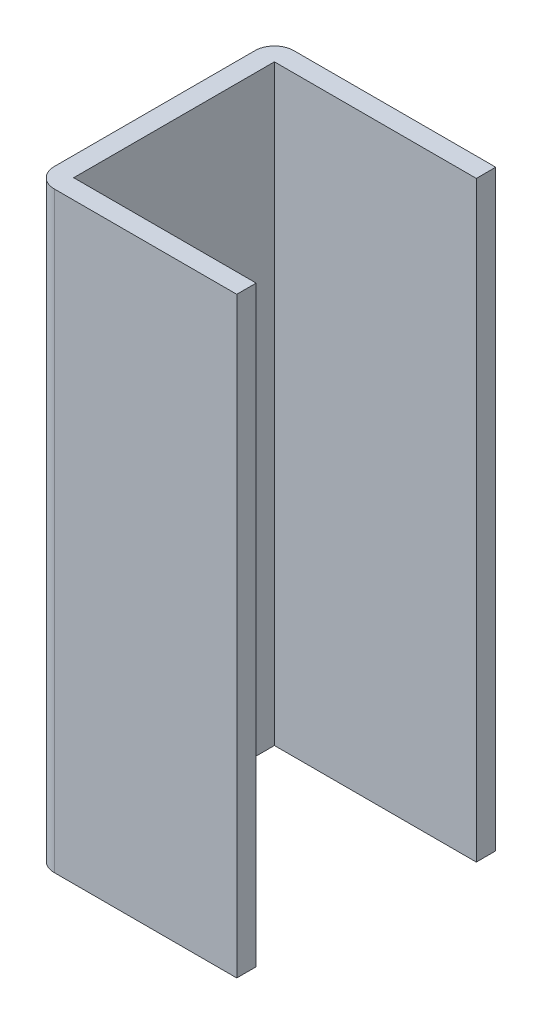
ISO-10303-21;
HEADER;
FILE_DESCRIPTION(('STEP AP214'),'2;1');
FILE_NAME('part.step','',(''),(''),'','','');
FILE_SCHEMA(('AUTOMOTIVE_DESIGN { 1 0 10303 214 1 1 1 1 }'));
ENDSEC;
DATA;
#1=APPLICATION_CONTEXT('core data for automotive mechanical design processes');
#2=APPLICATION_PROTOCOL_DEFINITION('international standard','automotive_design',2000,#1);
#3=PRODUCT_CONTEXT('',#1,'mechanical');
#4=PRODUCT('Part','Part','',(#3));
#5=PRODUCT_RELATED_PRODUCT_CATEGORY('part','',(#4));
#6=PRODUCT_DEFINITION_FORMATION('','',#4);
#7=PRODUCT_DEFINITION_CONTEXT('part definition',#1,'design');
#8=PRODUCT_DEFINITION('design','',#6,#7);
#9=PRODUCT_DEFINITION_SHAPE('','',#8);
#10=(LENGTH_UNIT() NAMED_UNIT(*) SI_UNIT(.MILLI.,.METRE.));
#11=(NAMED_UNIT(*) PLANE_ANGLE_UNIT() SI_UNIT($,.RADIAN.));
#12=(NAMED_UNIT(*) SI_UNIT($,.STERADIAN.) SOLID_ANGLE_UNIT());
#13=UNCERTAINTY_MEASURE_WITH_UNIT(LENGTH_MEASURE(1.E-05),#10,'distance_accuracy_value','');
#14=(GEOMETRIC_REPRESENTATION_CONTEXT(3) GLOBAL_UNCERTAINTY_ASSIGNED_CONTEXT((#13)) GLOBAL_UNIT_ASSIGNED_CONTEXT((#10,
#11,#12)) REPRESENTATION_CONTEXT('',''));
#15=CARTESIAN_POINT('',(0.,0.,0.));
#16=DIRECTION('',(0.,0.,1.));
#17=DIRECTION('',(1.,0.,0.));
#18=AXIS2_PLACEMENT_3D('',#15,#16,#17);
#19=CARTESIAN_POINT('',(-2.93,-1.525,1.134));
#20=DIRECTION('',(1.,0.,0.));
#21=DIRECTION('',(0.,0.,-1.));
#22=AXIS2_PLACEMENT_3D('',#19,#20,#21);
#23=PLANE('',#22);
#24=DIRECTION('',(0.,0.,-1.));
#25=VECTOR('',#24,1.);
#26=CARTESIAN_POINT('',(-2.93,1.525,1.134));
#27=LINE('',#26,#25);
#28=CARTESIAN_POINT('',(-2.93,1.525,1.134));
#29=VERTEX_POINT('',#28);
#30=CARTESIAN_POINT('',(-2.93,1.525,1.234));
#31=VERTEX_POINT('',#30);
#32=EDGE_CURVE('E101',#29,#31,#27,.F.);
#33=ORIENTED_EDGE('',*,*,#32,.T.);
#34=DIRECTION('',(0.,1.,0.));
#35=VECTOR('',#34,1.);
#36=CARTESIAN_POINT('',(-2.93,-1.525,1.234));
#37=LINE('',#36,#35);
#38=CARTESIAN_POINT('',(-2.93,-1.525,1.234));
#39=VERTEX_POINT('',#38);
#40=EDGE_CURVE('E96',#39,#31,#37,.T.);
#41=ORIENTED_EDGE('',*,*,#40,.F.);
#42=DIRECTION('',(0.,0.,-1.));
#43=VECTOR('',#42,1.);
#44=CARTESIAN_POINT('',(-2.93,-1.525,1.134));
#45=LINE('',#44,#43);
#46=CARTESIAN_POINT('',(-2.93,-1.525,1.134));
#47=VERTEX_POINT('',#46);
#48=EDGE_CURVE('E135',#39,#47,#45,.T.);
#49=ORIENTED_EDGE('',*,*,#48,.T.);
#50=DIRECTION('',(0.,1.,0.));
#51=VECTOR('',#50,1.);
#52=CARTESIAN_POINT('',(-2.93,-1.525,1.134));
#53=LINE('',#52,#51);
#54=EDGE_CURVE('E111',#47,#29,#53,.T.);
#55=ORIENTED_EDGE('',*,*,#54,.T.);
#56=EDGE_LOOP('',(#33,#41,#49,#55));
#57=FACE_BOUND('',#56,.T.);
#58=ADVANCED_FACE('F17',(#57),#23,.T.);
#59=CARTESIAN_POINT('',(-3.97,-1.525,1.234));
#60=DIRECTION('',(0.,0.,1.));
#61=DIRECTION('',(1.,0.,0.));
#62=AXIS2_PLACEMENT_3D('',#59,#60,#61);
#63=PLANE('',#62);
#64=DIRECTION('',(1.,0.,0.));
#65=VECTOR('',#64,1.);
#66=CARTESIAN_POINT('',(-3.97,-1.525,1.234));
#67=LINE('',#66,#65);
#68=CARTESIAN_POINT('',(-3.87,-1.525,1.234));
#69=VERTEX_POINT('',#68);
#70=EDGE_CURVE('E100',#69,#39,#67,.T.);
#71=ORIENTED_EDGE('',*,*,#70,.T.);
#72=ORIENTED_EDGE('',*,*,#40,.T.);
#73=DIRECTION('',(1.,0.,0.));
#74=VECTOR('',#73,1.);
#75=CARTESIAN_POINT('',(-3.97,1.525,1.234));
#76=LINE('',#75,#74);
#77=CARTESIAN_POINT('',(-3.87,1.525,1.234));
#78=VERTEX_POINT('',#77);
#79=EDGE_CURVE('E91',#31,#78,#76,.F.);
#80=ORIENTED_EDGE('',*,*,#79,.T.);
#81=DIRECTION('',(0.,1.,0.));
#82=VECTOR('',#81,1.);
#83=CARTESIAN_POINT('',(-3.87,-1.525,1.234));
#84=LINE('',#83,#82);
#85=EDGE_CURVE('E94',#69,#78,#84,.T.);
#86=ORIENTED_EDGE('',*,*,#85,.F.);
#87=EDGE_LOOP('',(#71,#72,#80,#86));
#88=FACE_BOUND('',#87,.T.);
#89=ADVANCED_FACE('F93',(#88),#63,.T.);
#90=CARTESIAN_POINT('',(-3.97,-1.525,1.134));
#91=DIRECTION('',(0.,0.,1.));
#92=DIRECTION('',(1.,0.,0.));
#93=AXIS2_PLACEMENT_3D('',#90,#91,#92);
#94=PLANE('',#93);
#95=DIRECTION('',(1.,0.,0.));
#96=VECTOR('',#95,1.);
#97=CARTESIAN_POINT('',(-3.97,-1.525,1.134));
#98=LINE('',#97,#96);
#99=CARTESIAN_POINT('',(-3.87,-1.525,1.134));
#100=VERTEX_POINT('',#99);
#101=EDGE_CURVE('E143',#100,#47,#98,.T.);
#102=ORIENTED_EDGE('',*,*,#101,.F.);
#103=DIRECTION('',(0.,1.,0.));
#104=VECTOR('',#103,1.);
#105=CARTESIAN_POINT('',(-3.87,-1.525,1.134));
#106=LINE('',#105,#104);
#107=CARTESIAN_POINT('',(-3.87,1.525,1.134));
#108=VERTEX_POINT('',#107);
#109=EDGE_CURVE('E155',#108,#100,#106,.F.);
#110=ORIENTED_EDGE('',*,*,#109,.F.);
#111=DIRECTION('',(1.,0.,0.));
#112=VECTOR('',#111,1.);
#113=CARTESIAN_POINT('',(-3.97,1.525,1.134));
#114=LINE('',#113,#112);
#115=EDGE_CURVE('E131',#29,#108,#114,.F.);
#116=ORIENTED_EDGE('',*,*,#115,.F.);
#117=ORIENTED_EDGE('',*,*,#54,.F.);
#118=EDGE_LOOP('',(#102,#110,#116,#117));
#119=FACE_BOUND('',#118,.T.);
#120=ADVANCED_FACE('F309',(#119),#94,.F.);
#121=CARTESIAN_POINT('',(-3.87,-1.525,1.134));
#122=DIRECTION('',(0.,1.,0.));
#123=DIRECTION('',(0.,0.,1.));
#124=AXIS2_PLACEMENT_3D('',#121,#122,#123);
#125=CYLINDRICAL_SURFACE('',#124,0.1);
#126=DIRECTION('',(0.,1.,0.));
#127=VECTOR('',#126,1.);
#128=CARTESIAN_POINT('',(-3.97,-1.525,1.134));
#129=LINE('',#128,#127);
#130=CARTESIAN_POINT('',(-3.97,1.525,1.134));
#131=VERTEX_POINT('',#130);
#132=CARTESIAN_POINT('',(-3.97,-1.525,1.134));
#133=VERTEX_POINT('',#132);
#134=EDGE_CURVE('E168',#131,#133,#129,.F.);
#135=ORIENTED_EDGE('',*,*,#134,.T.);
#136=CARTESIAN_POINT('',(-3.87,-1.525,1.134));
#137=DIRECTION('',(0.,1.,0.));
#138=DIRECTION('',(0.,0.,1.));
#139=AXIS2_PLACEMENT_3D('',#136,#137,#138);
#140=CIRCLE('',#139,0.1);
#141=EDGE_CURVE('E110',#133,#69,#140,.T.);
#142=ORIENTED_EDGE('',*,*,#141,.T.);
#143=ORIENTED_EDGE('',*,*,#85,.T.);
#144=CARTESIAN_POINT('',(-3.87,1.525,1.134));
#145=DIRECTION('',(0.,1.,0.));
#146=DIRECTION('',(0.,0.,1.));
#147=AXIS2_PLACEMENT_3D('',#144,#145,#146);
#148=CIRCLE('',#147,0.1);
#149=EDGE_CURVE('E20',#78,#131,#148,.F.);
#150=ORIENTED_EDGE('',*,*,#149,.T.);
#151=EDGE_LOOP('',(#135,#142,#143,#150));
#152=FACE_BOUND('',#151,.T.);
#153=ADVANCED_FACE('F107',(#152),#125,.T.);
#154=CARTESIAN_POINT('',(-3.87,-1.525,0.));
#155=DIRECTION('',(1.,0.,0.));
#156=DIRECTION('',(0.,0.,-1.));
#157=AXIS2_PLACEMENT_3D('',#154,#155,#156);
#158=PLANE('',#157);
#159=DIRECTION('',(0.,0.,-1.));
#160=VECTOR('',#159,1.);
#161=CARTESIAN_POINT('',(-3.87,1.525,0.));
#162=LINE('',#161,#160);
#163=CARTESIAN_POINT('',(-3.87,1.525,0.1));
#164=VERTEX_POINT('',#163);
#165=EDGE_CURVE('E119',#164,#108,#162,.F.);
#166=ORIENTED_EDGE('',*,*,#165,.T.);
#167=ORIENTED_EDGE('',*,*,#109,.T.);
#168=DIRECTION('',(0.,0.,-1.));
#169=VECTOR('',#168,1.);
#170=CARTESIAN_POINT('',(-3.87,-1.525,0.));
#171=LINE('',#170,#169);
#172=CARTESIAN_POINT('',(-3.87,-1.525,0.1));
#173=VERTEX_POINT('',#172);
#174=EDGE_CURVE('E118',#100,#173,#171,.T.);
#175=ORIENTED_EDGE('',*,*,#174,.T.);
#176=DIRECTION('',(0.,1.,0.));
#177=VECTOR('',#176,1.);
#178=CARTESIAN_POINT('',(-3.87,-1.525,0.1));
#179=LINE('',#178,#177);
#180=EDGE_CURVE('E170',#164,#173,#179,.F.);
#181=ORIENTED_EDGE('',*,*,#180,.F.);
#182=EDGE_LOOP('',(#166,#167,#175,#181));
#183=FACE_BOUND('',#182,.T.);
#184=ADVANCED_FACE('F230',(#183),#158,.T.);
#185=CARTESIAN_POINT('',(-3.97,-1.525,0.));
#186=DIRECTION('',(1.,0.,0.));
#187=DIRECTION('',(0.,0.,-1.));
#188=AXIS2_PLACEMENT_3D('',#185,#186,#187);
#189=PLANE('',#188);
#190=DIRECTION('',(0.,0.,1.));
#191=VECTOR('',#190,1.);
#192=CARTESIAN_POINT('',(-3.97,1.525,0.599890766445));
#193=LINE('',#192,#191);
#194=CARTESIAN_POINT('',(-3.97,1.525,0.1));
#195=VERTEX_POINT('',#194);
#196=EDGE_CURVE('E117',#195,#131,#193,.T.);
#197=ORIENTED_EDGE('',*,*,#196,.F.);
#198=DIRECTION('',(0.,1.,0.));
#199=VECTOR('',#198,1.);
#200=CARTESIAN_POINT('',(-3.97,-1.525,0.1));
#201=LINE('',#200,#199);
#202=CARTESIAN_POINT('',(-3.97,-1.525,0.1));
#203=VERTEX_POINT('',#202);
#204=EDGE_CURVE('E125',#203,#195,#201,.T.);
#205=ORIENTED_EDGE('',*,*,#204,.F.);
#206=DIRECTION('',(0.,0.,-1.));
#207=VECTOR('',#206,1.);
#208=CARTESIAN_POINT('',(-3.97,-1.525,0.));
#209=LINE('',#208,#207);
#210=EDGE_CURVE('E158',#133,#203,#209,.T.);
#211=ORIENTED_EDGE('',*,*,#210,.F.);
#212=ORIENTED_EDGE('',*,*,#134,.F.);
#213=EDGE_LOOP('',(#197,#205,#211,#212));
#214=FACE_BOUND('',#213,.T.);
#215=ADVANCED_FACE('F227',(#214),#189,.F.);
#216=CARTESIAN_POINT('',(-3.97,-1.525,0.1));
#217=DIRECTION('',(0.,0.,1.));
#218=DIRECTION('',(1.,0.,0.));
#219=AXIS2_PLACEMENT_3D('',#216,#217,#218);
#220=PLANE('',#219);
#221=DIRECTION('',(1.,0.,0.));
#222=VECTOR('',#221,1.);
#223=CARTESIAN_POINT('',(-3.563753771877,-1.525,0.1));
#224=LINE('',#223,#222);
#225=CARTESIAN_POINT('',(-2.83,-1.525,0.1));
#226=VERTEX_POINT('',#225);
#227=EDGE_CURVE('E127',#226,#173,#224,.F.);
#228=ORIENTED_EDGE('',*,*,#227,.F.);
#229=DIRECTION('',(0.,1.,0.));
#230=VECTOR('',#229,1.);
#231=CARTESIAN_POINT('',(-2.83,-1.525,0.1));
#232=LINE('',#231,#230);
#233=CARTESIAN_POINT('',(-2.83,1.525,0.1));
#234=VERTEX_POINT('',#233);
#235=EDGE_CURVE('E184',#234,#226,#232,.F.);
#236=ORIENTED_EDGE('',*,*,#235,.F.);
#237=DIRECTION('',(-1.,0.,0.));
#238=VECTOR('',#237,1.);
#239=CARTESIAN_POINT('',(-3.563753771877,1.525,0.1));
#240=LINE('',#239,#238);
#241=EDGE_CURVE('E173',#164,#234,#240,.F.);
#242=ORIENTED_EDGE('',*,*,#241,.F.);
#243=ORIENTED_EDGE('',*,*,#180,.T.);
#244=EDGE_LOOP('',(#228,#236,#242,#243));
#245=FACE_BOUND('',#244,.T.);
#246=ADVANCED_FACE('F229',(#245),#220,.T.);
#247=CARTESIAN_POINT('',(-3.563753771877,1.525,0.599890766445));
#248=DIRECTION('',(0.,1.,0.));
#249=DIRECTION('',(-1.,0.,0.));
#250=AXIS2_PLACEMENT_3D('',#247,#248,#249);
#251=PLANE('',#250);
#252=ORIENTED_EDGE('',*,*,#241,.T.);
#253=DIRECTION('',(0.,0.,-1.));
#254=VECTOR('',#253,1.);
#255=CARTESIAN_POINT('',(-2.83,1.525,0.));
#256=LINE('',#255,#254);
#257=CARTESIAN_POINT('',(-2.83,1.525,0.));
#258=VERTEX_POINT('',#257);
#259=EDGE_CURVE('E187',#258,#234,#256,.F.);
#260=ORIENTED_EDGE('',*,*,#259,.F.);
#261=DIRECTION('',(1.,0.,0.));
#262=VECTOR('',#261,1.);
#263=CARTESIAN_POINT('',(-3.97,1.525,0.));
#264=LINE('',#263,#262);
#265=CARTESIAN_POINT('',(-3.87,1.525,0.));
#266=VERTEX_POINT('',#265);
#267=EDGE_CURVE('E186',#258,#266,#264,.F.);
#268=ORIENTED_EDGE('',*,*,#267,.T.);
#269=CARTESIAN_POINT('',(-3.87,1.525,0.1));
#270=DIRECTION('',(0.,1.,0.));
#271=DIRECTION('',(0.,0.,1.));
#272=AXIS2_PLACEMENT_3D('',#269,#270,#271);
#273=CIRCLE('',#272,0.1);
#274=EDGE_CURVE('E122',#195,#266,#273,.F.);
#275=ORIENTED_EDGE('',*,*,#274,.F.);
#276=ORIENTED_EDGE('',*,*,#196,.T.);
#277=ORIENTED_EDGE('',*,*,#149,.F.);
#278=ORIENTED_EDGE('',*,*,#79,.F.);
#279=ORIENTED_EDGE('',*,*,#32,.F.);
#280=ORIENTED_EDGE('',*,*,#115,.T.);
#281=ORIENTED_EDGE('',*,*,#165,.F.);
#282=EDGE_LOOP('',(#252,#260,#268,#275,#276,#277,#278,#279,#280,#281));
#283=FACE_BOUND('',#282,.T.);
#284=ADVANCED_FACE('F114',(#283),#251,.T.);
#285=CARTESIAN_POINT('',(-3.87,-1.525,0.1));
#286=DIRECTION('',(0.,1.,0.));
#287=DIRECTION('',(0.,0.,1.));
#288=AXIS2_PLACEMENT_3D('',#285,#286,#287);
#289=CYLINDRICAL_SURFACE('',#288,0.1);
#290=DIRECTION('',(0.,1.,0.));
#291=VECTOR('',#290,1.);
#292=CARTESIAN_POINT('',(-3.87,-1.525,0.));
#293=LINE('',#292,#291);
#294=CARTESIAN_POINT('',(-3.87,-1.525,0.));
#295=VERTEX_POINT('',#294);
#296=EDGE_CURVE('E200',#266,#295,#293,.F.);
#297=ORIENTED_EDGE('',*,*,#296,.T.);
#298=CARTESIAN_POINT('',(-3.87,-1.525,0.1));
#299=DIRECTION('',(0.,1.,0.));
#300=DIRECTION('',(0.,0.,1.));
#301=AXIS2_PLACEMENT_3D('',#298,#299,#300);
#302=CIRCLE('',#301,0.1);
#303=EDGE_CURVE('E124',#203,#295,#302,.F.);
#304=ORIENTED_EDGE('',*,*,#303,.F.);
#305=ORIENTED_EDGE('',*,*,#204,.T.);
#306=ORIENTED_EDGE('',*,*,#274,.T.);
#307=EDGE_LOOP('',(#297,#304,#305,#306));
#308=FACE_BOUND('',#307,.T.);
#309=ADVANCED_FACE('F214',(#308),#289,.T.);
#310=CARTESIAN_POINT('',(-3.563753771877,-1.525,0.599890766445));
#311=DIRECTION('',(0.,-1.,0.));
#312=DIRECTION('',(1.,0.,0.));
#313=AXIS2_PLACEMENT_3D('',#310,#311,#312);
#314=PLANE('',#313);
#315=ORIENTED_EDGE('',*,*,#101,.T.);
#316=ORIENTED_EDGE('',*,*,#48,.F.);
#317=ORIENTED_EDGE('',*,*,#70,.F.);
#318=ORIENTED_EDGE('',*,*,#141,.F.);
#319=ORIENTED_EDGE('',*,*,#210,.T.);
#320=ORIENTED_EDGE('',*,*,#303,.T.);
#321=DIRECTION('',(1.,0.,0.));
#322=VECTOR('',#321,1.);
#323=CARTESIAN_POINT('',(-3.97,-1.525,0.));
#324=LINE('',#323,#322);
#325=CARTESIAN_POINT('',(-2.83,-1.525,0.));
#326=VERTEX_POINT('',#325);
#327=EDGE_CURVE('E26',#295,#326,#324,.T.);
#328=ORIENTED_EDGE('',*,*,#327,.T.);
#329=DIRECTION('',(0.,0.,-1.));
#330=VECTOR('',#329,1.);
#331=CARTESIAN_POINT('',(-2.83,-1.525,0.));
#332=LINE('',#331,#330);
#333=EDGE_CURVE('E34',#226,#326,#332,.T.);
#334=ORIENTED_EDGE('',*,*,#333,.F.);
#335=ORIENTED_EDGE('',*,*,#227,.T.);
#336=ORIENTED_EDGE('',*,*,#174,.F.);
#337=EDGE_LOOP('',(#315,#316,#317,#318,#319,#320,#328,#334,#335,#336));
#338=FACE_BOUND('',#337,.T.);
#339=ADVANCED_FACE('F224',(#338),#314,.T.);
#340=CARTESIAN_POINT('',(-2.83,-1.525,0.));
#341=DIRECTION('',(1.,0.,0.));
#342=DIRECTION('',(0.,0.,-1.));
#343=AXIS2_PLACEMENT_3D('',#340,#341,#342);
#344=PLANE('',#343);
#345=ORIENTED_EDGE('',*,*,#259,.T.);
#346=ORIENTED_EDGE('',*,*,#235,.T.);
#347=ORIENTED_EDGE('',*,*,#333,.T.);
#348=DIRECTION('',(0.,1.,0.));
#349=VECTOR('',#348,1.);
#350=CARTESIAN_POINT('',(-2.83,-1.525,0.));
#351=LINE('',#350,#349);
#352=EDGE_CURVE('E11',#326,#258,#351,.T.);
#353=ORIENTED_EDGE('',*,*,#352,.T.);
#354=EDGE_LOOP('',(#345,#346,#347,#353));
#355=FACE_BOUND('',#354,.T.);
#356=ADVANCED_FACE('F222',(#355),#344,.T.);
#357=CARTESIAN_POINT('',(-3.97,-1.525,0.));
#358=DIRECTION('',(0.,0.,1.));
#359=DIRECTION('',(1.,0.,0.));
#360=AXIS2_PLACEMENT_3D('',#357,#358,#359);
#361=PLANE('',#360);
#362=ORIENTED_EDGE('',*,*,#327,.F.);
#363=ORIENTED_EDGE('',*,*,#296,.F.);
#364=ORIENTED_EDGE('',*,*,#267,.F.);
#365=ORIENTED_EDGE('',*,*,#352,.F.);
#366=EDGE_LOOP('',(#362,#363,#364,#365));
#367=FACE_BOUND('',#366,.T.);
#368=ADVANCED_FACE('F218',(#367),#361,.F.);
#369=CLOSED_SHELL('',(#58,#89,#120,#153,#184,#215,#246,#284,#309,#339,#356,#368));
#370=MANIFOLD_SOLID_BREP('B1',#369);
#371=ADVANCED_BREP_SHAPE_REPRESENTATION('',(#18,#370),#14);
#372=SHAPE_DEFINITION_REPRESENTATION(#9,#371);
ENDSEC;
END-ISO-10303-21;
